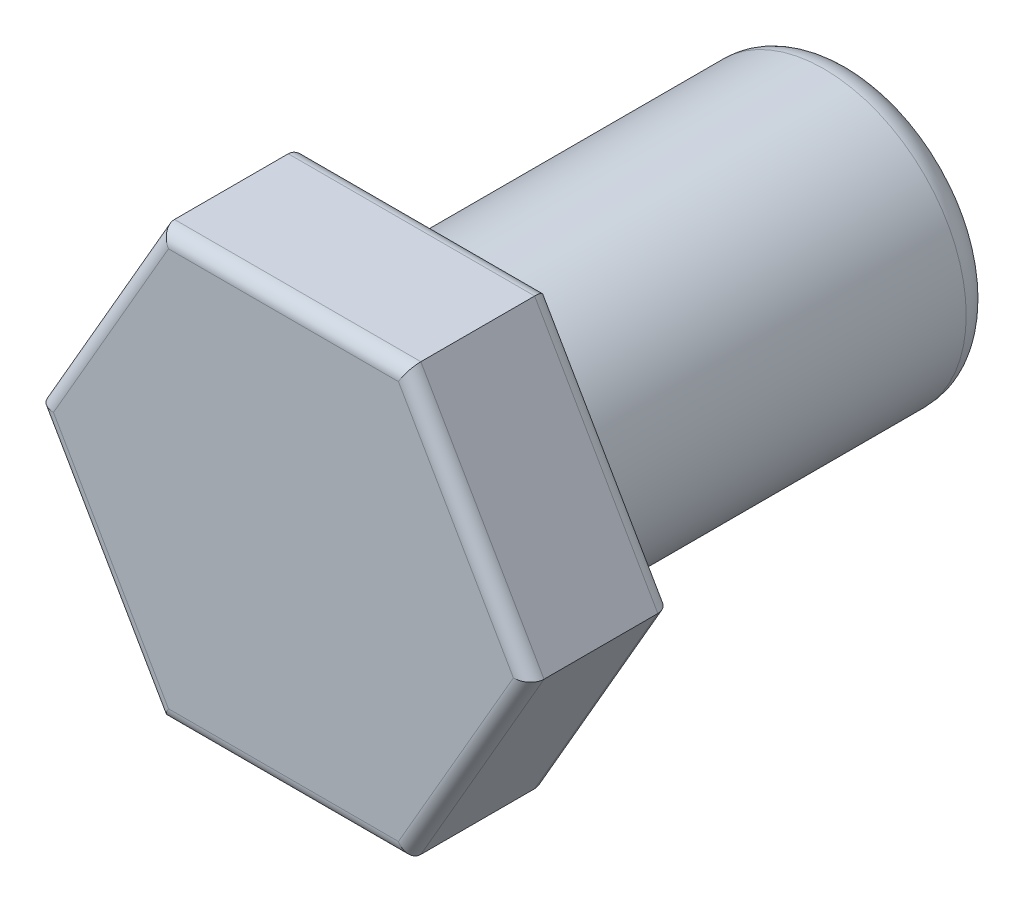
ISO-10303-21;
HEADER;
FILE_DESCRIPTION(('STEP AP214'),'2;1');
FILE_NAME('part.step','',(''),(''),'','','');
FILE_SCHEMA(('AUTOMOTIVE_DESIGN { 1 0 10303 214 1 1 1 1 }'));
ENDSEC;
DATA;
#1=APPLICATION_CONTEXT('core data for automotive mechanical design processes');
#2=APPLICATION_PROTOCOL_DEFINITION('international standard','automotive_design',2000,#1);
#3=PRODUCT_CONTEXT('',#1,'mechanical');
#4=PRODUCT('Part','Part','',(#3));
#5=PRODUCT_RELATED_PRODUCT_CATEGORY('part','',(#4));
#6=PRODUCT_DEFINITION_FORMATION('','',#4);
#7=PRODUCT_DEFINITION_CONTEXT('part definition',#1,'design');
#8=PRODUCT_DEFINITION('design','',#6,#7);
#9=PRODUCT_DEFINITION_SHAPE('','',#8);
#10=(LENGTH_UNIT() NAMED_UNIT(*) SI_UNIT(.MILLI.,.METRE.));
#11=(NAMED_UNIT(*) PLANE_ANGLE_UNIT() SI_UNIT($,.RADIAN.));
#12=(NAMED_UNIT(*) SI_UNIT($,.STERADIAN.) SOLID_ANGLE_UNIT());
#13=UNCERTAINTY_MEASURE_WITH_UNIT(LENGTH_MEASURE(1.E-05),#10,'distance_accuracy_value','');
#14=(GEOMETRIC_REPRESENTATION_CONTEXT(3) GLOBAL_UNCERTAINTY_ASSIGNED_CONTEXT((#13)) GLOBAL_UNIT_ASSIGNED_CONTEXT((#10,
#11,#12)) REPRESENTATION_CONTEXT('',''));
#15=CARTESIAN_POINT('',(0.,0.,0.));
#16=DIRECTION('',(0.,0.,1.));
#17=DIRECTION('',(1.,0.,0.));
#18=AXIS2_PLACEMENT_3D('',#15,#16,#17);
#19=CARTESIAN_POINT('',(0.,0.,15.));
#20=DIRECTION('',(0.,0.,-1.));
#21=DIRECTION('',(-1.,0.,0.));
#22=AXIS2_PLACEMENT_3D('',#19,#20,#21);
#23=CYLINDRICAL_SURFACE('',#22,5.);
#24=CARTESIAN_POINT('',(0.,0.,1.));
#25=DIRECTION('',(0.,0.,1.));
#26=DIRECTION('',(1.,0.,0.));
#27=AXIS2_PLACEMENT_3D('',#24,#25,#26);
#28=CIRCLE('',#27,5.);
#29=CARTESIAN_POINT('',(5.,0.,1.));
#30=VERTEX_POINT('',#29);
#31=EDGE_CURVE('E42',#30,#30,#28,.T.);
#32=ORIENTED_EDGE('',*,*,#31,.T.);
#33=EDGE_LOOP('',(#32));
#34=FACE_BOUND('',#33,.T.);
#35=CARTESIAN_POINT('',(0.,0.,15.));
#36=DIRECTION('',(0.,0.,1.));
#37=DIRECTION('',(1.,0.,0.));
#38=AXIS2_PLACEMENT_3D('',#35,#36,#37);
#39=CIRCLE('',#38,5.);
#40=CARTESIAN_POINT('',(5.,0.,15.));
#41=VERTEX_POINT('',#40);
#42=EDGE_CURVE('E150',#41,#41,#39,.T.);
#43=ORIENTED_EDGE('',*,*,#42,.F.);
#44=EDGE_LOOP('',(#43));
#45=FACE_BOUND('',#44,.T.);
#46=ADVANCED_FACE('F34',(#34,#45),#23,.T.);
#47=CARTESIAN_POINT('',(0.,0.,0.));
#48=DIRECTION('',(0.,0.,1.));
#49=DIRECTION('',(1.,0.,0.));
#50=AXIS2_PLACEMENT_3D('',#47,#48,#49);
#51=PLANE('',#50);
#52=CARTESIAN_POINT('',(0.,0.,0.));
#53=DIRECTION('',(0.,0.,1.));
#54=DIRECTION('',(1.,0.,0.));
#55=AXIS2_PLACEMENT_3D('',#52,#53,#54);
#56=CIRCLE('',#55,4.);
#57=CARTESIAN_POINT('',(4.,0.,0.));
#58=VERTEX_POINT('',#57);
#59=EDGE_CURVE('E11',#58,#58,#56,.F.);
#60=ORIENTED_EDGE('',*,*,#59,.T.);
#61=EDGE_LOOP('',(#60));
#62=FACE_BOUND('',#61,.T.);
#63=ADVANCED_FACE('F240',(#62),#51,.F.);
#64=CARTESIAN_POINT('',(0.,0.,15.));
#65=DIRECTION('',(0.,0.,1.));
#66=DIRECTION('',(1.,0.,0.));
#67=AXIS2_PLACEMENT_3D('',#64,#65,#66);
#68=PLANE('',#67);
#69=DIRECTION('',(0.5,0.866025403784439,0.));
#70=VECTOR('',#69,1.);
#71=CARTESIAN_POINT('',(6.06217782649107,-3.5,15.));
#72=LINE('',#71,#70);
#73=CARTESIAN_POINT('',(8.08290376865476,0.,15.));
#74=VERTEX_POINT('',#73);
#75=CARTESIAN_POINT('',(4.04145188432738,-7.,15.));
#76=VERTEX_POINT('',#75);
#77=EDGE_CURVE('E182',#74,#76,#72,.F.);
#78=ORIENTED_EDGE('',*,*,#77,.T.);
#79=DIRECTION('',(1.,0.,0.));
#80=VECTOR('',#79,1.);
#81=CARTESIAN_POINT('',(0.,-7.,15.));
#82=LINE('',#81,#80);
#83=CARTESIAN_POINT('',(-4.04145188432738,-7.,15.));
#84=VERTEX_POINT('',#83);
#85=EDGE_CURVE('E188',#76,#84,#82,.F.);
#86=ORIENTED_EDGE('',*,*,#85,.T.);
#87=DIRECTION('',(0.5,-0.866025403784439,0.));
#88=VECTOR('',#87,1.);
#89=CARTESIAN_POINT('',(-6.06217782649107,-3.5,15.));
#90=LINE('',#89,#88);
#91=CARTESIAN_POINT('',(-8.08290376865476,0.,15.));
#92=VERTEX_POINT('',#91);
#93=EDGE_CURVE('E186',#84,#92,#90,.F.);
#94=ORIENTED_EDGE('',*,*,#93,.T.);
#95=DIRECTION('',(-0.5,-0.866025403784439,0.));
#96=VECTOR('',#95,1.);
#97=CARTESIAN_POINT('',(-6.06217782649107,3.5,15.));
#98=LINE('',#97,#96);
#99=CARTESIAN_POINT('',(-4.04145188432738,7.,15.));
#100=VERTEX_POINT('',#99);
#101=EDGE_CURVE('E184',#92,#100,#98,.F.);
#102=ORIENTED_EDGE('',*,*,#101,.T.);
#103=DIRECTION('',(-1.,0.,0.));
#104=VECTOR('',#103,1.);
#105=CARTESIAN_POINT('',(0.,7.,15.));
#106=LINE('',#105,#104);
#107=CARTESIAN_POINT('',(4.04145188432737,7.,15.));
#108=VERTEX_POINT('',#107);
#109=EDGE_CURVE('E178',#100,#108,#106,.F.);
#110=ORIENTED_EDGE('',*,*,#109,.T.);
#111=DIRECTION('',(-0.5,0.866025403784438,0.));
#112=VECTOR('',#111,1.);
#113=CARTESIAN_POINT('',(6.06217782649107,3.5,15.));
#114=LINE('',#113,#112);
#115=EDGE_CURVE('E180',#108,#74,#114,.F.);
#116=ORIENTED_EDGE('',*,*,#115,.T.);
#117=EDGE_LOOP('',(#78,#86,#94,#102,#110,#116));
#118=FACE_BOUND('',#117,.T.);
#119=ORIENTED_EDGE('',*,*,#42,.T.);
#120=EDGE_LOOP('',(#119));
#121=FACE_BOUND('',#120,.T.);
#122=ADVANCED_FACE('F245',(#118,#121),#68,.F.);
#123=CARTESIAN_POINT('',(-4.33012701892219,-7.5,20.));
#124=DIRECTION('',(0.,1.,0.));
#125=DIRECTION('',(-1.,0.,0.));
#126=AXIS2_PLACEMENT_3D('',#123,#124,#125);
#127=PLANE('',#126);
#128=DIRECTION('',(0.,0.,-1.));
#129=VECTOR('',#128,1.);
#130=CARTESIAN_POINT('',(4.33012701892219,-7.5,20.));
#131=LINE('',#130,#129);
#132=CARTESIAN_POINT('',(4.33012701892219,-7.5,19.5));
#133=VERTEX_POINT('',#132);
#134=CARTESIAN_POINT('',(4.33012701892219,-7.5,15.5));
#135=VERTEX_POINT('',#134);
#136=EDGE_CURVE('E153',#133,#135,#131,.T.);
#137=ORIENTED_EDGE('',*,*,#136,.F.);
#138=DIRECTION('',(1.,0.,0.));
#139=VECTOR('',#138,1.);
#140=CARTESIAN_POINT('',(-4.33012701892219,-7.5,19.5));
#141=LINE('',#140,#139);
#142=CARTESIAN_POINT('',(-4.33012701892219,-7.5,19.5));
#143=VERTEX_POINT('',#142);
#144=EDGE_CURVE('E172',#133,#143,#141,.F.);
#145=ORIENTED_EDGE('',*,*,#144,.T.);
#146=DIRECTION('',(0.,0.,-1.));
#147=VECTOR('',#146,1.);
#148=CARTESIAN_POINT('',(-4.33012701892219,-7.5,20.));
#149=LINE('',#148,#147);
#150=CARTESIAN_POINT('',(-4.33012701892219,-7.5,15.5));
#151=VERTEX_POINT('',#150);
#152=EDGE_CURVE('E143',#143,#151,#149,.T.);
#153=ORIENTED_EDGE('',*,*,#152,.T.);
#154=DIRECTION('',(1.,0.,0.));
#155=VECTOR('',#154,1.);
#156=CARTESIAN_POINT('',(-4.33012701892219,-7.5,15.5));
#157=LINE('',#156,#155);
#158=EDGE_CURVE('E169',#151,#135,#157,.T.);
#159=ORIENTED_EDGE('',*,*,#158,.T.);
#160=EDGE_LOOP('',(#137,#145,#153,#159));
#161=FACE_BOUND('',#160,.T.);
#162=ADVANCED_FACE('F316',(#161),#127,.F.);
#163=CARTESIAN_POINT('',(4.33012701892219,-7.5,20.));
#164=DIRECTION('',(-0.866025403784439,0.5,0.));
#165=DIRECTION('',(-0.5,-0.866025403784439,0.));
#166=AXIS2_PLACEMENT_3D('',#163,#164,#165);
#167=PLANE('',#166);
#168=DIRECTION('',(0.,0.,-1.));
#169=VECTOR('',#168,1.);
#170=CARTESIAN_POINT('',(8.66025403784438,0.,20.));
#171=LINE('',#170,#169);
#172=CARTESIAN_POINT('',(8.66025403784438,0.,19.5));
#173=VERTEX_POINT('',#172);
#174=CARTESIAN_POINT('',(8.66025403784438,0.,15.5));
#175=VERTEX_POINT('',#174);
#176=EDGE_CURVE('E327',#173,#175,#171,.T.);
#177=ORIENTED_EDGE('',*,*,#176,.F.);
#178=DIRECTION('',(0.5,0.866025403784439,0.));
#179=VECTOR('',#178,1.);
#180=CARTESIAN_POINT('',(4.33012701892219,-7.5,19.5));
#181=LINE('',#180,#179);
#182=EDGE_CURVE('E176',#173,#133,#181,.F.);
#183=ORIENTED_EDGE('',*,*,#182,.T.);
#184=ORIENTED_EDGE('',*,*,#136,.T.);
#185=DIRECTION('',(0.5,0.866025403784439,0.));
#186=VECTOR('',#185,1.);
#187=CARTESIAN_POINT('',(4.33012701892219,-7.5,15.5));
#188=LINE('',#187,#186);
#189=EDGE_CURVE('E174',#135,#175,#188,.T.);
#190=ORIENTED_EDGE('',*,*,#189,.T.);
#191=EDGE_LOOP('',(#177,#183,#184,#190));
#192=FACE_BOUND('',#191,.T.);
#193=ADVANCED_FACE('F330',(#192),#167,.F.);
#194=CARTESIAN_POINT('',(8.66025403784438,0.,20.));
#195=DIRECTION('',(-0.866025403784438,-0.5,0.));
#196=DIRECTION('',(0.5,-0.866025403784438,0.));
#197=AXIS2_PLACEMENT_3D('',#194,#195,#196);
#198=PLANE('',#197);
#199=ORIENTED_EDGE('',*,*,#176,.T.);
#200=DIRECTION('',(-0.5,0.866025403784438,0.));
#201=VECTOR('',#200,1.);
#202=CARTESIAN_POINT('',(8.66025403784438,0.,15.5));
#203=LINE('',#202,#201);
#204=CARTESIAN_POINT('',(4.33012701892219,7.5,15.5));
#205=VERTEX_POINT('',#204);
#206=EDGE_CURVE('E49',#175,#205,#203,.T.);
#207=ORIENTED_EDGE('',*,*,#206,.T.);
#208=DIRECTION('',(0.,0.,-1.));
#209=VECTOR('',#208,1.);
#210=CARTESIAN_POINT('',(4.33012701892219,7.5,20.));
#211=LINE('',#210,#209);
#212=CARTESIAN_POINT('',(4.33012701892219,7.5,19.5));
#213=VERTEX_POINT('',#212);
#214=EDGE_CURVE('E325',#213,#205,#211,.T.);
#215=ORIENTED_EDGE('',*,*,#214,.F.);
#216=DIRECTION('',(-0.5,0.866025403784438,0.));
#217=VECTOR('',#216,1.);
#218=CARTESIAN_POINT('',(8.66025403784438,0.,19.5));
#219=LINE('',#218,#217);
#220=EDGE_CURVE('E141',#213,#173,#219,.F.);
#221=ORIENTED_EDGE('',*,*,#220,.T.);
#222=EDGE_LOOP('',(#199,#207,#215,#221));
#223=FACE_BOUND('',#222,.T.);
#224=ADVANCED_FACE('F342',(#223),#198,.F.);
#225=CARTESIAN_POINT('',(4.33012701892219,7.5,20.));
#226=DIRECTION('',(0.,-1.,0.));
#227=DIRECTION('',(0.,0.,-1.));
#228=AXIS2_PLACEMENT_3D('',#225,#226,#227);
#229=PLANE('',#228);
#230=DIRECTION('',(0.,0.,-1.));
#231=VECTOR('',#230,1.);
#232=CARTESIAN_POINT('',(-4.3301270189222,7.5,20.));
#233=LINE('',#232,#231);
#234=CARTESIAN_POINT('',(-4.3301270189222,7.5,19.5));
#235=VERTEX_POINT('',#234);
#236=CARTESIAN_POINT('',(-4.3301270189222,7.5,15.5));
#237=VERTEX_POINT('',#236);
#238=EDGE_CURVE('E320',#235,#237,#233,.T.);
#239=ORIENTED_EDGE('',*,*,#238,.F.);
#240=DIRECTION('',(-1.,0.,0.));
#241=VECTOR('',#240,1.);
#242=CARTESIAN_POINT('',(4.33012701892219,7.5,19.5));
#243=LINE('',#242,#241);
#244=EDGE_CURVE('E56',#235,#213,#243,.F.);
#245=ORIENTED_EDGE('',*,*,#244,.T.);
#246=ORIENTED_EDGE('',*,*,#214,.T.);
#247=DIRECTION('',(-1.,0.,0.));
#248=VECTOR('',#247,1.);
#249=CARTESIAN_POINT('',(4.33012701892219,7.5,15.5));
#250=LINE('',#249,#248);
#251=EDGE_CURVE('E197',#205,#237,#250,.T.);
#252=ORIENTED_EDGE('',*,*,#251,.T.);
#253=EDGE_LOOP('',(#239,#245,#246,#252));
#254=FACE_BOUND('',#253,.T.);
#255=ADVANCED_FACE('F341',(#254),#229,.F.);
#256=CARTESIAN_POINT('',(-4.3301270189222,7.5,20.));
#257=DIRECTION('',(0.866025403784439,-0.5,0.));
#258=DIRECTION('',(0.5,0.866025403784439,0.));
#259=AXIS2_PLACEMENT_3D('',#256,#257,#258);
#260=PLANE('',#259);
#261=DIRECTION('',(0.,0.,-1.));
#262=VECTOR('',#261,1.);
#263=CARTESIAN_POINT('',(-8.66025403784439,0.,20.));
#264=LINE('',#263,#262);
#265=CARTESIAN_POINT('',(-8.66025403784439,0.,19.5));
#266=VERTEX_POINT('',#265);
#267=CARTESIAN_POINT('',(-8.66025403784439,0.,15.5));
#268=VERTEX_POINT('',#267);
#269=EDGE_CURVE('E313',#266,#268,#264,.T.);
#270=ORIENTED_EDGE('',*,*,#269,.F.);
#271=DIRECTION('',(-0.5,-0.866025403784439,0.));
#272=VECTOR('',#271,1.);
#273=CARTESIAN_POINT('',(-4.33012701892219,7.5,19.5));
#274=LINE('',#273,#272);
#275=EDGE_CURVE('E193',#266,#235,#274,.F.);
#276=ORIENTED_EDGE('',*,*,#275,.T.);
#277=ORIENTED_EDGE('',*,*,#238,.T.);
#278=DIRECTION('',(-0.5,-0.866025403784439,0.));
#279=VECTOR('',#278,1.);
#280=CARTESIAN_POINT('',(-4.3301270189222,7.5,15.5));
#281=LINE('',#280,#279);
#282=EDGE_CURVE('E191',#237,#268,#281,.T.);
#283=ORIENTED_EDGE('',*,*,#282,.T.);
#284=EDGE_LOOP('',(#270,#276,#277,#283));
#285=FACE_BOUND('',#284,.T.);
#286=ADVANCED_FACE('F340',(#285),#260,.F.);
#287=CARTESIAN_POINT('',(-8.66025403784439,0.,20.));
#288=DIRECTION('',(0.866025403784439,0.5,0.));
#289=DIRECTION('',(-0.5,0.866025403784439,0.));
#290=AXIS2_PLACEMENT_3D('',#287,#288,#289);
#291=PLANE('',#290);
#292=ORIENTED_EDGE('',*,*,#152,.F.);
#293=DIRECTION('',(0.5,-0.866025403784439,0.));
#294=VECTOR('',#293,1.);
#295=CARTESIAN_POINT('',(-8.66025403784439,0.,19.5));
#296=LINE('',#295,#294);
#297=EDGE_CURVE('E166',#143,#266,#296,.F.);
#298=ORIENTED_EDGE('',*,*,#297,.T.);
#299=ORIENTED_EDGE('',*,*,#269,.T.);
#300=DIRECTION('',(0.5,-0.866025403784439,0.));
#301=VECTOR('',#300,1.);
#302=CARTESIAN_POINT('',(-8.66025403784439,0.,15.5));
#303=LINE('',#302,#301);
#304=EDGE_CURVE('E164',#268,#151,#303,.T.);
#305=ORIENTED_EDGE('',*,*,#304,.T.);
#306=EDGE_LOOP('',(#292,#298,#299,#305));
#307=FACE_BOUND('',#306,.T.);
#308=ADVANCED_FACE('F310',(#307),#291,.F.);
#309=CARTESIAN_POINT('',(0.,0.,20.));
#310=DIRECTION('',(0.,0.,1.));
#311=DIRECTION('',(1.,0.,0.));
#312=AXIS2_PLACEMENT_3D('',#309,#310,#311);
#313=PLANE('',#312);
#314=DIRECTION('',(-0.5,-0.866025403784439,0.));
#315=VECTOR('',#314,1.);
#316=CARTESIAN_POINT('',(-8.22724133595217,-0.249999999999998,20.));
#317=LINE('',#316,#315);
#318=CARTESIAN_POINT('',(-4.04145188432738,7.,20.));
#319=VERTEX_POINT('',#318);
#320=CARTESIAN_POINT('',(-8.08290376865476,0.,20.));
#321=VERTEX_POINT('',#320);
#322=EDGE_CURVE('E135',#319,#321,#317,.T.);
#323=ORIENTED_EDGE('',*,*,#322,.T.);
#324=DIRECTION('',(0.5,-0.866025403784439,0.));
#325=VECTOR('',#324,1.);
#326=CARTESIAN_POINT('',(-3.89711431702997,-7.25,20.));
#327=LINE('',#326,#325);
#328=CARTESIAN_POINT('',(-4.04145188432738,-7.,20.));
#329=VERTEX_POINT('',#328);
#330=EDGE_CURVE('E161',#321,#329,#327,.T.);
#331=ORIENTED_EDGE('',*,*,#330,.T.);
#332=DIRECTION('',(1.,0.,0.));
#333=VECTOR('',#332,1.);
#334=CARTESIAN_POINT('',(4.33012701892219,-7.,20.));
#335=LINE('',#334,#333);
#336=CARTESIAN_POINT('',(4.04145188432738,-7.,20.));
#337=VERTEX_POINT('',#336);
#338=EDGE_CURVE('E159',#329,#337,#335,.T.);
#339=ORIENTED_EDGE('',*,*,#338,.T.);
#340=DIRECTION('',(0.5,0.866025403784439,0.));
#341=VECTOR('',#340,1.);
#342=CARTESIAN_POINT('',(8.22724133595217,0.250000000000002,20.));
#343=LINE('',#342,#341);
#344=CARTESIAN_POINT('',(8.08290376865476,0.,20.));
#345=VERTEX_POINT('',#344);
#346=EDGE_CURVE('E131',#337,#345,#343,.T.);
#347=ORIENTED_EDGE('',*,*,#346,.T.);
#348=DIRECTION('',(-0.5,0.866025403784438,0.));
#349=VECTOR('',#348,1.);
#350=CARTESIAN_POINT('',(3.89711431702997,7.25,20.));
#351=LINE('',#350,#349);
#352=CARTESIAN_POINT('',(4.04145188432737,7.,20.));
#353=VERTEX_POINT('',#352);
#354=EDGE_CURVE('E124',#345,#353,#351,.T.);
#355=ORIENTED_EDGE('',*,*,#354,.T.);
#356=DIRECTION('',(-1.,0.,0.));
#357=VECTOR('',#356,1.);
#358=CARTESIAN_POINT('',(-4.3301270189222,7.,20.));
#359=LINE('',#358,#357);
#360=EDGE_CURVE('E128',#353,#319,#359,.T.);
#361=ORIENTED_EDGE('',*,*,#360,.T.);
#362=EDGE_LOOP('',(#323,#331,#339,#347,#355,#361));
#363=FACE_BOUND('',#362,.T.);
#364=ADVANCED_FACE('F126',(#363),#313,.T.);
#365=CARTESIAN_POINT('',(6.06217782649107,3.5,19.5));
#366=DIRECTION('',(0.5,-0.866025403784438,0.));
#367=DIRECTION('',(0.866025403784438,0.5,0.));
#368=AXIS2_PLACEMENT_3D('',#365,#366,#367);
#369=CYLINDRICAL_SURFACE('',#368,0.5);
#370=CARTESIAN_POINT('',(8.08290376865476,0.,19.5));
#371=DIRECTION('',(0.,-1.,0.));
#372=DIRECTION('',(1.,0.,0.));
#373=AXIS2_PLACEMENT_3D('',#370,#371,#372);
#374=ELLIPSE('',#373,0.577350269189626,0.5);
#375=EDGE_CURVE('E144',#173,#345,#374,.T.);
#376=ORIENTED_EDGE('',*,*,#375,.F.);
#377=ORIENTED_EDGE('',*,*,#220,.F.);
#378=CARTESIAN_POINT('',(4.04145188432737,7.,19.5));
#379=DIRECTION('',(0.866025403784439,-0.5,0.));
#380=DIRECTION('',(0.5,0.866025403784439,0.));
#381=AXIS2_PLACEMENT_3D('',#378,#379,#380);
#382=ELLIPSE('',#381,0.577350269189626,0.5);
#383=EDGE_CURVE('E139',#353,#213,#382,.F.);
#384=ORIENTED_EDGE('',*,*,#383,.F.);
#385=ORIENTED_EDGE('',*,*,#354,.F.);
#386=EDGE_LOOP('',(#376,#377,#384,#385));
#387=FACE_BOUND('',#386,.T.);
#388=ADVANCED_FACE('F140',(#387),#369,.T.);
#389=CARTESIAN_POINT('',(0.,7.,19.5));
#390=DIRECTION('',(1.,0.,0.));
#391=DIRECTION('',(0.,0.,-1.));
#392=AXIS2_PLACEMENT_3D('',#389,#390,#391);
#393=CYLINDRICAL_SURFACE('',#392,0.5);
#394=ORIENTED_EDGE('',*,*,#383,.T.);
#395=ORIENTED_EDGE('',*,*,#244,.F.);
#396=CARTESIAN_POINT('',(-4.04145188432738,7.,19.5));
#397=DIRECTION('',(0.866025403784439,0.5,0.));
#398=DIRECTION('',(0.5,-0.866025403784439,0.));
#399=AXIS2_PLACEMENT_3D('',#396,#397,#398);
#400=ELLIPSE('',#399,0.577350269189626,0.5);
#401=EDGE_CURVE('E148',#319,#235,#400,.F.);
#402=ORIENTED_EDGE('',*,*,#401,.F.);
#403=ORIENTED_EDGE('',*,*,#360,.F.);
#404=EDGE_LOOP('',(#394,#395,#402,#403));
#405=FACE_BOUND('',#404,.T.);
#406=ADVANCED_FACE('F146',(#405),#393,.T.);
#407=CARTESIAN_POINT('',(6.06217782649107,-3.5,19.5));
#408=DIRECTION('',(-0.5,-0.866025403784439,0.));
#409=DIRECTION('',(0.866025403784439,-0.5,0.));
#410=AXIS2_PLACEMENT_3D('',#407,#408,#409);
#411=CYLINDRICAL_SURFACE('',#410,0.5);
#412=ORIENTED_EDGE('',*,*,#375,.T.);
#413=ORIENTED_EDGE('',*,*,#346,.F.);
#414=CARTESIAN_POINT('',(4.04145188432738,-7.,19.5));
#415=DIRECTION('',(-0.866025403784439,-0.5,0.));
#416=DIRECTION('',(0.5,-0.866025403784439,0.));
#417=AXIS2_PLACEMENT_3D('',#414,#415,#416);
#418=ELLIPSE('',#417,0.577350269189626,0.5);
#419=EDGE_CURVE('E205',#133,#337,#418,.T.);
#420=ORIENTED_EDGE('',*,*,#419,.F.);
#421=ORIENTED_EDGE('',*,*,#182,.F.);
#422=EDGE_LOOP('',(#412,#413,#420,#421));
#423=FACE_BOUND('',#422,.T.);
#424=ADVANCED_FACE('F262',(#423),#411,.T.);
#425=CARTESIAN_POINT('',(-6.06217782649107,3.5,19.5));
#426=DIRECTION('',(0.5,0.866025403784439,0.));
#427=DIRECTION('',(-0.866025403784439,0.5,0.));
#428=AXIS2_PLACEMENT_3D('',#425,#426,#427);
#429=CYLINDRICAL_SURFACE('',#428,0.5);
#430=ORIENTED_EDGE('',*,*,#401,.T.);
#431=ORIENTED_EDGE('',*,*,#275,.F.);
#432=CARTESIAN_POINT('',(-8.08290376865476,0.,19.5));
#433=DIRECTION('',(0.,1.,0.));
#434=DIRECTION('',(1.,0.,0.));
#435=AXIS2_PLACEMENT_3D('',#432,#433,#434);
#436=ELLIPSE('',#435,0.577350269189626,0.5);
#437=EDGE_CURVE('E202',#321,#266,#436,.F.);
#438=ORIENTED_EDGE('',*,*,#437,.F.);
#439=ORIENTED_EDGE('',*,*,#322,.F.);
#440=EDGE_LOOP('',(#430,#431,#438,#439));
#441=FACE_BOUND('',#440,.T.);
#442=ADVANCED_FACE('F258',(#441),#429,.T.);
#443=CARTESIAN_POINT('',(0.,-7.,19.5));
#444=DIRECTION('',(-1.,0.,0.));
#445=DIRECTION('',(0.,-1.,0.));
#446=AXIS2_PLACEMENT_3D('',#443,#444,#445);
#447=CYLINDRICAL_SURFACE('',#446,0.5);
#448=ORIENTED_EDGE('',*,*,#419,.T.);
#449=ORIENTED_EDGE('',*,*,#338,.F.);
#450=CARTESIAN_POINT('',(-4.04145188432738,-7.,19.5));
#451=DIRECTION('',(-0.866025403784439,0.5,0.));
#452=DIRECTION('',(-0.5,-0.866025403784439,0.));
#453=AXIS2_PLACEMENT_3D('',#450,#451,#452);
#454=ELLIPSE('',#453,0.577350269189626,0.5);
#455=EDGE_CURVE('E200',#143,#329,#454,.T.);
#456=ORIENTED_EDGE('',*,*,#455,.F.);
#457=ORIENTED_EDGE('',*,*,#144,.F.);
#458=EDGE_LOOP('',(#448,#449,#456,#457));
#459=FACE_BOUND('',#458,.T.);
#460=ADVANCED_FACE('F254',(#459),#447,.T.);
#461=CARTESIAN_POINT('',(-6.06217782649107,-3.5,19.5));
#462=DIRECTION('',(-0.5,0.866025403784439,0.));
#463=DIRECTION('',(-0.866025403784439,-0.5,0.));
#464=AXIS2_PLACEMENT_3D('',#461,#462,#463);
#465=CYLINDRICAL_SURFACE('',#464,0.5);
#466=ORIENTED_EDGE('',*,*,#437,.T.);
#467=ORIENTED_EDGE('',*,*,#297,.F.);
#468=ORIENTED_EDGE('',*,*,#455,.T.);
#469=ORIENTED_EDGE('',*,*,#330,.F.);
#470=EDGE_LOOP('',(#466,#467,#468,#469));
#471=FACE_BOUND('',#470,.T.);
#472=ADVANCED_FACE('F250',(#471),#465,.T.);
#473=CARTESIAN_POINT('',(4.33012701892219,7.,15.5));
#474=DIRECTION('',(-1.,0.,0.));
#475=DIRECTION('',(0.,0.,1.));
#476=AXIS2_PLACEMENT_3D('',#473,#474,#475);
#477=CYLINDRICAL_SURFACE('',#476,0.5);
#478=CARTESIAN_POINT('',(4.04145188432737,7.,15.5));
#479=DIRECTION('',(-0.866025403784439,0.5,0.));
#480=DIRECTION('',(-0.5,-0.866025403784439,0.));
#481=AXIS2_PLACEMENT_3D('',#478,#479,#480);
#482=ELLIPSE('',#481,0.577350269189626,0.5);
#483=EDGE_CURVE('E220',#108,#205,#482,.F.);
#484=ORIENTED_EDGE('',*,*,#483,.F.);
#485=ORIENTED_EDGE('',*,*,#109,.F.);
#486=CARTESIAN_POINT('',(-4.04145188432738,7.,15.5));
#487=DIRECTION('',(-0.866025403784439,-0.5,0.));
#488=DIRECTION('',(-0.5,0.866025403784439,0.));
#489=AXIS2_PLACEMENT_3D('',#486,#487,#488);
#490=ELLIPSE('',#489,0.577350269189626,0.5);
#491=EDGE_CURVE('E203',#237,#100,#490,.T.);
#492=ORIENTED_EDGE('',*,*,#491,.F.);
#493=ORIENTED_EDGE('',*,*,#251,.F.);
#494=EDGE_LOOP('',(#484,#485,#492,#493));
#495=FACE_BOUND('',#494,.T.);
#496=ADVANCED_FACE('F253',(#495),#477,.T.);
#497=CARTESIAN_POINT('',(-3.89711431702998,7.25,15.5));
#498=DIRECTION('',(-0.5,-0.866025403784439,0.));
#499=DIRECTION('',(0.866025403784439,-0.5,0.));
#500=AXIS2_PLACEMENT_3D('',#497,#498,#499);
#501=CYLINDRICAL_SURFACE('',#500,0.5);
#502=ORIENTED_EDGE('',*,*,#491,.T.);
#503=ORIENTED_EDGE('',*,*,#101,.F.);
#504=CARTESIAN_POINT('',(-8.08290376865476,0.,15.5));
#505=DIRECTION('',(0.,-1.,0.));
#506=DIRECTION('',(-1.,0.,0.));
#507=AXIS2_PLACEMENT_3D('',#504,#505,#506);
#508=ELLIPSE('',#507,0.577350269189626,0.5);
#509=EDGE_CURVE('E217',#268,#92,#508,.T.);
#510=ORIENTED_EDGE('',*,*,#509,.F.);
#511=ORIENTED_EDGE('',*,*,#282,.F.);
#512=EDGE_LOOP('',(#502,#503,#510,#511));
#513=FACE_BOUND('',#512,.T.);
#514=ADVANCED_FACE('F281',(#513),#501,.T.);
#515=CARTESIAN_POINT('',(8.22724133595216,-0.249999999999998,15.5));
#516=DIRECTION('',(-0.5,0.866025403784438,0.));
#517=DIRECTION('',(-0.866025403784438,-0.5,0.));
#518=AXIS2_PLACEMENT_3D('',#515,#516,#517);
#519=CYLINDRICAL_SURFACE('',#518,0.5);
#520=ORIENTED_EDGE('',*,*,#483,.T.);
#521=ORIENTED_EDGE('',*,*,#206,.F.);
#522=CARTESIAN_POINT('',(8.08290376865476,0.,15.5));
#523=DIRECTION('',(0.,1.,0.));
#524=DIRECTION('',(-1.,0.,0.));
#525=AXIS2_PLACEMENT_3D('',#522,#523,#524);
#526=ELLIPSE('',#525,0.577350269189626,0.5);
#527=EDGE_CURVE('E214',#74,#175,#526,.F.);
#528=ORIENTED_EDGE('',*,*,#527,.F.);
#529=ORIENTED_EDGE('',*,*,#115,.F.);
#530=EDGE_LOOP('',(#520,#521,#528,#529));
#531=FACE_BOUND('',#530,.T.);
#532=ADVANCED_FACE('F277',(#531),#519,.T.);
#533=CARTESIAN_POINT('',(-8.22724133595217,0.250000000000004,15.5));
#534=DIRECTION('',(0.5,-0.866025403784439,0.));
#535=DIRECTION('',(0.866025403784439,0.5,0.));
#536=AXIS2_PLACEMENT_3D('',#533,#534,#535);
#537=CYLINDRICAL_SURFACE('',#536,0.5);
#538=ORIENTED_EDGE('',*,*,#509,.T.);
#539=ORIENTED_EDGE('',*,*,#93,.F.);
#540=CARTESIAN_POINT('',(-4.04145188432738,-7.,15.5));
#541=DIRECTION('',(0.866025403784439,-0.5,0.));
#542=DIRECTION('',(-0.5,-0.866025403784439,0.));
#543=AXIS2_PLACEMENT_3D('',#540,#541,#542);
#544=ELLIPSE('',#543,0.577350269189626,0.5);
#545=EDGE_CURVE('E212',#151,#84,#544,.T.);
#546=ORIENTED_EDGE('',*,*,#545,.F.);
#547=ORIENTED_EDGE('',*,*,#304,.F.);
#548=EDGE_LOOP('',(#538,#539,#546,#547));
#549=FACE_BOUND('',#548,.T.);
#550=ADVANCED_FACE('F273',(#549),#537,.T.);
#551=CARTESIAN_POINT('',(3.89711431702997,-7.25,15.5));
#552=DIRECTION('',(0.5,0.866025403784439,0.));
#553=DIRECTION('',(-0.866025403784439,0.5,0.));
#554=AXIS2_PLACEMENT_3D('',#551,#552,#553);
#555=CYLINDRICAL_SURFACE('',#554,0.5);
#556=ORIENTED_EDGE('',*,*,#527,.T.);
#557=ORIENTED_EDGE('',*,*,#189,.F.);
#558=CARTESIAN_POINT('',(4.04145188432738,-7.,15.5));
#559=DIRECTION('',(0.866025403784439,0.5,0.));
#560=DIRECTION('',(-0.5,0.866025403784439,0.));
#561=AXIS2_PLACEMENT_3D('',#558,#559,#560);
#562=ELLIPSE('',#561,0.577350269189626,0.5);
#563=EDGE_CURVE('E210',#76,#135,#562,.F.);
#564=ORIENTED_EDGE('',*,*,#563,.F.);
#565=ORIENTED_EDGE('',*,*,#77,.F.);
#566=EDGE_LOOP('',(#556,#557,#564,#565));
#567=FACE_BOUND('',#566,.T.);
#568=ADVANCED_FACE('F235',(#567),#555,.T.);
#569=CARTESIAN_POINT('',(-4.33012701892219,-7.,15.5));
#570=DIRECTION('',(1.,0.,0.));
#571=DIRECTION('',(0.,1.,0.));
#572=AXIS2_PLACEMENT_3D('',#569,#570,#571);
#573=CYLINDRICAL_SURFACE('',#572,0.5);
#574=ORIENTED_EDGE('',*,*,#545,.T.);
#575=ORIENTED_EDGE('',*,*,#85,.F.);
#576=ORIENTED_EDGE('',*,*,#563,.T.);
#577=ORIENTED_EDGE('',*,*,#158,.F.);
#578=EDGE_LOOP('',(#574,#575,#576,#577));
#579=FACE_BOUND('',#578,.T.);
#580=ADVANCED_FACE('F230',(#579),#573,.T.);
#581=CARTESIAN_POINT('',(0.,0.,1.));
#582=DIRECTION('',(0.,0.,1.));
#583=DIRECTION('',(1.,0.,0.));
#584=AXIS2_PLACEMENT_3D('',#581,#582,#583);
#585=TOROIDAL_SURFACE('',#584,4.,1.);
#586=ORIENTED_EDGE('',*,*,#59,.F.);
#587=EDGE_LOOP('',(#586));
#588=FACE_BOUND('',#587,.T.);
#589=ORIENTED_EDGE('',*,*,#31,.F.);
#590=EDGE_LOOP('',(#589));
#591=FACE_BOUND('',#590,.T.);
#592=ADVANCED_FACE('F36',(#588,#591),#585,.T.);
#593=CLOSED_SHELL('',(#46,#63,#122,#162,#193,#224,#255,#286,#308,#364,#388,#406,#424,#442,#460,
#472,#496,#514,#532,#550,#568,#580,#592));
#594=MANIFOLD_SOLID_BREP('B2',#593);
#595=ADVANCED_BREP_SHAPE_REPRESENTATION('',(#18,#594),#14);
#596=SHAPE_DEFINITION_REPRESENTATION(#9,#595);
ENDSEC;
END-ISO-10303-21;
